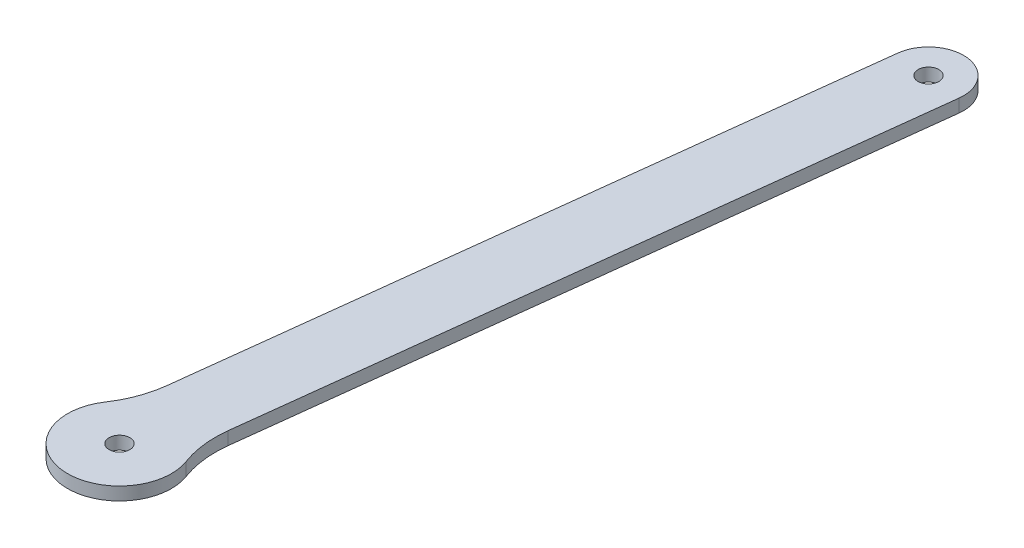
ISO-10303-21;
HEADER;
FILE_DESCRIPTION(('STEP AP214'),'2;1');
FILE_NAME('part.step','',(''),(''),'','','');
FILE_SCHEMA(('AUTOMOTIVE_DESIGN { 1 0 10303 214 1 1 1 1 }'));
ENDSEC;
DATA;
#1=APPLICATION_CONTEXT('core data for automotive mechanical design processes');
#2=APPLICATION_PROTOCOL_DEFINITION('international standard','automotive_design',2000,#1);
#3=PRODUCT_CONTEXT('',#1,'mechanical');
#4=PRODUCT('Part','Part','',(#3));
#5=PRODUCT_RELATED_PRODUCT_CATEGORY('part','',(#4));
#6=PRODUCT_DEFINITION_FORMATION('','',#4);
#7=PRODUCT_DEFINITION_CONTEXT('part definition',#1,'design');
#8=PRODUCT_DEFINITION('design','',#6,#7);
#9=PRODUCT_DEFINITION_SHAPE('','',#8);
#10=(LENGTH_UNIT() NAMED_UNIT(*) SI_UNIT(.MILLI.,.METRE.));
#11=(NAMED_UNIT(*) PLANE_ANGLE_UNIT() SI_UNIT($,.RADIAN.));
#12=(NAMED_UNIT(*) SI_UNIT($,.STERADIAN.) SOLID_ANGLE_UNIT());
#13=UNCERTAINTY_MEASURE_WITH_UNIT(LENGTH_MEASURE(1.E-05),#10,'distance_accuracy_value','');
#14=(GEOMETRIC_REPRESENTATION_CONTEXT(3) GLOBAL_UNCERTAINTY_ASSIGNED_CONTEXT((#13)) GLOBAL_UNIT_ASSIGNED_CONTEXT((#10,
#11,#12)) REPRESENTATION_CONTEXT('',''));
#15=CARTESIAN_POINT('',(0.,0.,0.));
#16=DIRECTION('',(0.,0.,1.));
#17=DIRECTION('',(1.,0.,0.));
#18=AXIS2_PLACEMENT_3D('',#15,#16,#17);
#19=CARTESIAN_POINT('',(25.654,-50.8574683301547,-3.78135023293424E-11));
#20=DIRECTION('',(0.,-1.,0.));
#21=DIRECTION('',(1.,0.,0.));
#22=AXIS2_PLACEMENT_3D('',#19,#20,#21);
#23=PLANE('',#22);
#24=CARTESIAN_POINT('',(17.272,-50.8574683301547,70.7182535302327));
#25=DIRECTION('',(0.,-1.,0.));
#26=DIRECTION('',(1.,0.,0.));
#27=AXIS2_PLACEMENT_3D('',#24,#25,#26);
#28=CIRCLE('',#27,1.01599999999988);
#29=CARTESIAN_POINT('',(18.2879999999999,-50.8574683301547,70.7182535302327));
#30=VERTEX_POINT('',#29);
#31=EDGE_CURVE('E151',#30,#30,#28,.T.);
#32=ORIENTED_EDGE('',*,*,#31,.F.);
#33=EDGE_LOOP('',(#32));
#34=FACE_BOUND('',#33,.T.);
#35=CARTESIAN_POINT('',(25.654,-50.8574683301547,-3.78135023293424E-11));
#36=DIRECTION('',(0.,-1.,0.));
#37=DIRECTION('',(1.,0.,0.));
#38=AXIS2_PLACEMENT_3D('',#35,#36,#37);
#39=CIRCLE('',#38,3.429);
#40=CARTESIAN_POINT('',(22.2488354325944,-50.8574683301547,-0.403602860390931));
#41=VERTEX_POINT('',#40);
#42=CARTESIAN_POINT('',(29.0591645674056,-50.8574683301547,0.403602860315304));
#43=VERTEX_POINT('',#42);
#44=EDGE_CURVE('E98',#41,#43,#39,.T.);
#45=ORIENTED_EDGE('',*,*,#44,.T.);
#46=DIRECTION('',(-0.117702788087815,0.,0.993048867718178));
#47=VECTOR('',#46,1.);
#48=CARTESIAN_POINT('',(29.0591645674056,-50.8574683301547,0.403602860315304));
#49=LINE('',#48,#47);
#50=CARTESIAN_POINT('',(21.4846808329558,-50.8574683301547,64.3089072141369));
#51=VERTEX_POINT('',#50);
#52=EDGE_CURVE('E89',#43,#51,#49,.T.);
#53=ORIENTED_EDGE('',*,*,#52,.T.);
#54=CARTESIAN_POINT('',(31.4151695101375,-50.8574683301547,65.4859350950151));
#55=DIRECTION('',(0.,-1.,0.));
#56=DIRECTION('',(1.,0.,0.));
#57=AXIS2_PLACEMENT_3D('',#54,#55,#56);
#58=CIRCLE('',#57,10.);
#59=CARTESIAN_POINT('',(22.0364098880305,-50.8574683301547,68.9556422801726));
#60=VERTEX_POINT('',#59);
#61=EDGE_CURVE('E11',#51,#60,#58,.F.);
#62=ORIENTED_EDGE('',*,*,#61,.T.);
#63=CARTESIAN_POINT('',(17.272,-50.8574683301547,70.7182535302327));
#64=DIRECTION('',(0.,-1.,0.));
#65=DIRECTION('',(1.,0.,0.));
#66=AXIS2_PLACEMENT_3D('',#63,#64,#65);
#67=CIRCLE('',#66,5.0800000000001);
#68=CARTESIAN_POINT('',(13.0516461635603,-50.8574683301547,67.8907080407224));
#69=VERTEX_POINT('',#68);
#70=EDGE_CURVE('E97',#60,#69,#67,.T.);
#71=ORIENTED_EDGE('',*,*,#70,.T.);
#72=CARTESIAN_POINT('',(4.74386302096273,-50.8574683301547,62.3246736125526));
#73=DIRECTION('',(0.,-1.,0.));
#74=DIRECTION('',(1.,0.,0.));
#75=AXIS2_PLACEMENT_3D('',#72,#73,#74);
#76=CIRCLE('',#75,10.);
#77=CARTESIAN_POINT('',(14.6743516981445,-50.8574683301547,63.5017014934308));
#78=VERTEX_POINT('',#77);
#79=EDGE_CURVE('E128',#69,#78,#76,.F.);
#80=ORIENTED_EDGE('',*,*,#79,.T.);
#81=DIRECTION('',(0.117702788087815,0.,-0.993048867718178));
#82=VECTOR('',#81,1.);
#83=CARTESIAN_POINT('',(22.2488354325944,-50.8574683301547,-0.403602860390931));
#84=LINE('',#83,#82);
#85=EDGE_CURVE('E103',#78,#41,#84,.T.);
#86=ORIENTED_EDGE('',*,*,#85,.T.);
#87=EDGE_LOOP('',(#45,#53,#62,#71,#80,#86));
#88=FACE_BOUND('',#87,.T.);
#89=CARTESIAN_POINT('',(25.654,-50.8574683301547,-3.78135023293424E-11));
#90=DIRECTION('',(0.,-1.,0.));
#91=DIRECTION('',(1.,0.,0.));
#92=AXIS2_PLACEMENT_3D('',#89,#90,#91);
#93=CIRCLE('',#92,1.016);
#94=CARTESIAN_POINT('',(26.67,-50.8574683301547,-3.78135023293424E-11));
#95=VERTEX_POINT('',#94);
#96=EDGE_CURVE('E157',#95,#95,#93,.T.);
#97=ORIENTED_EDGE('',*,*,#96,.F.);
#98=EDGE_LOOP('',(#97));
#99=FACE_BOUND('',#98,.T.);
#100=ADVANCED_FACE('F40',(#34,#88,#99),#23,.T.);
#101=CARTESIAN_POINT('',(25.654,-49.5874683301547,-3.78135023293424E-11));
#102=DIRECTION('',(0.,-1.,0.));
#103=DIRECTION('',(1.,0.,0.));
#104=AXIS2_PLACEMENT_3D('',#101,#102,#103);
#105=PLANE('',#104);
#106=CARTESIAN_POINT('',(25.654,-49.5874683301547,-3.78135023293424E-11));
#107=DIRECTION('',(0.,-1.,0.));
#108=DIRECTION('',(1.,0.,0.));
#109=AXIS2_PLACEMENT_3D('',#106,#107,#108);
#110=CIRCLE('',#109,3.429);
#111=CARTESIAN_POINT('',(22.2488354325944,-49.5874683301547,-0.403602860390931));
#112=VERTEX_POINT('',#111);
#113=CARTESIAN_POINT('',(29.0591645674056,-49.5874683301547,0.403602860315304));
#114=VERTEX_POINT('',#113);
#115=EDGE_CURVE('E111',#112,#114,#110,.T.);
#116=ORIENTED_EDGE('',*,*,#115,.F.);
#117=DIRECTION('',(0.117702788087815,0.,-0.993048867718178));
#118=VECTOR('',#117,1.);
#119=CARTESIAN_POINT('',(22.2488354325944,-49.5874683301547,-0.403602860390931));
#120=LINE('',#119,#118);
#121=CARTESIAN_POINT('',(14.6743516981445,-49.5874683301547,63.5017014934308));
#122=VERTEX_POINT('',#121);
#123=EDGE_CURVE('E107',#122,#112,#120,.T.);
#124=ORIENTED_EDGE('',*,*,#123,.F.);
#125=CARTESIAN_POINT('',(4.74386302096273,-49.5874683301547,62.3246736125526));
#126=DIRECTION('',(0.,-1.,0.));
#127=DIRECTION('',(1.,0.,0.));
#128=AXIS2_PLACEMENT_3D('',#125,#126,#127);
#129=CIRCLE('',#128,10.);
#130=CARTESIAN_POINT('',(13.0516461635603,-49.5874683301547,67.8907080407224));
#131=VERTEX_POINT('',#130);
#132=EDGE_CURVE('E126',#122,#131,#129,.T.);
#133=ORIENTED_EDGE('',*,*,#132,.T.);
#134=CARTESIAN_POINT('',(17.272,-49.5874683301547,70.7182535302327));
#135=DIRECTION('',(0.,-1.,0.));
#136=DIRECTION('',(1.,0.,0.));
#137=AXIS2_PLACEMENT_3D('',#134,#135,#136);
#138=CIRCLE('',#137,5.0800000000001);
#139=CARTESIAN_POINT('',(22.0364098880305,-49.5874683301547,68.9556422801726));
#140=VERTEX_POINT('',#139);
#141=EDGE_CURVE('E143',#140,#131,#138,.T.);
#142=ORIENTED_EDGE('',*,*,#141,.F.);
#143=CARTESIAN_POINT('',(31.4151695101375,-49.5874683301547,65.4859350950151));
#144=DIRECTION('',(0.,-1.,0.));
#145=DIRECTION('',(1.,0.,0.));
#146=AXIS2_PLACEMENT_3D('',#143,#144,#145);
#147=CIRCLE('',#146,10.);
#148=CARTESIAN_POINT('',(21.4846808329558,-49.5874683301547,64.3089072141369));
#149=VERTEX_POINT('',#148);
#150=EDGE_CURVE('E48',#140,#149,#147,.T.);
#151=ORIENTED_EDGE('',*,*,#150,.T.);
#152=DIRECTION('',(-0.117702788087815,0.,0.993048867718178));
#153=VECTOR('',#152,1.);
#154=CARTESIAN_POINT('',(29.0591645674056,-49.5874683301547,0.403602860315304));
#155=LINE('',#154,#153);
#156=EDGE_CURVE('E147',#114,#149,#155,.T.);
#157=ORIENTED_EDGE('',*,*,#156,.F.);
#158=EDGE_LOOP('',(#116,#124,#133,#142,#151,#157));
#159=FACE_BOUND('',#158,.T.);
#160=CARTESIAN_POINT('',(17.272,-49.5874683301547,70.7182535302327));
#161=DIRECTION('',(0.,-1.,0.));
#162=DIRECTION('',(1.,0.,0.));
#163=AXIS2_PLACEMENT_3D('',#160,#161,#162);
#164=CIRCLE('',#163,1.01599999999988);
#165=CARTESIAN_POINT('',(18.2879999999999,-49.5874683301547,70.7182535302327));
#166=VERTEX_POINT('',#165);
#167=EDGE_CURVE('E154',#166,#166,#164,.T.);
#168=ORIENTED_EDGE('',*,*,#167,.T.);
#169=EDGE_LOOP('',(#168));
#170=FACE_BOUND('',#169,.T.);
#171=CARTESIAN_POINT('',(25.654,-49.5874683301547,-3.78135023293424E-11));
#172=DIRECTION('',(0.,-1.,0.));
#173=DIRECTION('',(1.,0.,0.));
#174=AXIS2_PLACEMENT_3D('',#171,#172,#173);
#175=CIRCLE('',#174,1.016);
#176=CARTESIAN_POINT('',(26.67,-49.5874683301547,-3.78135023293424E-11));
#177=VERTEX_POINT('',#176);
#178=EDGE_CURVE('E160',#177,#177,#175,.T.);
#179=ORIENTED_EDGE('',*,*,#178,.T.);
#180=EDGE_LOOP('',(#179));
#181=FACE_BOUND('',#180,.T.);
#182=ADVANCED_FACE('F141',(#159,#170,#181),#105,.F.);
#183=CARTESIAN_POINT('',(25.654,-50.8574683301547,-3.78135023293424E-11));
#184=DIRECTION('',(0.,1.,0.));
#185=DIRECTION('',(-1.,0.,0.));
#186=AXIS2_PLACEMENT_3D('',#183,#184,#185);
#187=CYLINDRICAL_SURFACE('',#186,3.429);
#188=ORIENTED_EDGE('',*,*,#115,.T.);
#189=DIRECTION('',(0.,1.,0.));
#190=VECTOR('',#189,1.);
#191=CARTESIAN_POINT('',(29.0591645674056,-50.8574683301547,0.403602860315304));
#192=LINE('',#191,#190);
#193=EDGE_CURVE('E93',#43,#114,#192,.T.);
#194=ORIENTED_EDGE('',*,*,#193,.F.);
#195=ORIENTED_EDGE('',*,*,#44,.F.);
#196=DIRECTION('',(0.,1.,0.));
#197=VECTOR('',#196,1.);
#198=CARTESIAN_POINT('',(22.2488354325944,-50.8574683301547,-0.403602860390931));
#199=LINE('',#198,#197);
#200=EDGE_CURVE('E113',#41,#112,#199,.T.);
#201=ORIENTED_EDGE('',*,*,#200,.T.);
#202=EDGE_LOOP('',(#188,#194,#195,#201));
#203=FACE_BOUND('',#202,.T.);
#204=ADVANCED_FACE('F109',(#203),#187,.T.);
#205=CARTESIAN_POINT('',(29.0591645674056,-50.8574683301547,0.403602860315304));
#206=DIRECTION('',(-0.993048867718178,0.,-0.117702788087815));
#207=DIRECTION('',(-0.117702788087815,0.,0.993048867718178));
#208=AXIS2_PLACEMENT_3D('',#205,#206,#207);
#209=PLANE('',#208);
#210=ORIENTED_EDGE('',*,*,#156,.T.);
#211=DIRECTION('',(0.,-1.,0.));
#212=VECTOR('',#211,1.);
#213=CARTESIAN_POINT('',(21.4846808329558,-50.8574683301547,64.3089072141369));
#214=LINE('',#213,#212);
#215=EDGE_CURVE('E55',#149,#51,#214,.T.);
#216=ORIENTED_EDGE('',*,*,#215,.T.);
#217=ORIENTED_EDGE('',*,*,#52,.F.);
#218=ORIENTED_EDGE('',*,*,#193,.T.);
#219=EDGE_LOOP('',(#210,#216,#217,#218));
#220=FACE_BOUND('',#219,.T.);
#221=ADVANCED_FACE('F91',(#220),#209,.F.);
#222=CARTESIAN_POINT('',(17.272,-50.8574683301547,70.7182535302327));
#223=DIRECTION('',(0.,1.,0.));
#224=DIRECTION('',(-1.,0.,0.));
#225=AXIS2_PLACEMENT_3D('',#222,#223,#224);
#226=CYLINDRICAL_SURFACE('',#225,5.0800000000001);
#227=ORIENTED_EDGE('',*,*,#141,.T.);
#228=DIRECTION('',(0.,1.,0.));
#229=VECTOR('',#228,1.);
#230=CARTESIAN_POINT('',(13.0516461635603,-50.8574683301547,67.8907080407224));
#231=LINE('',#230,#229);
#232=EDGE_CURVE('E123',#131,#69,#231,.F.);
#233=ORIENTED_EDGE('',*,*,#232,.T.);
#234=ORIENTED_EDGE('',*,*,#70,.F.);
#235=DIRECTION('',(0.,1.,0.));
#236=VECTOR('',#235,1.);
#237=CARTESIAN_POINT('',(22.0364098880305,-50.8574683301547,68.9556422801726));
#238=LINE('',#237,#236);
#239=EDGE_CURVE('E116',#60,#140,#238,.T.);
#240=ORIENTED_EDGE('',*,*,#239,.T.);
#241=EDGE_LOOP('',(#227,#233,#234,#240));
#242=FACE_BOUND('',#241,.T.);
#243=ADVANCED_FACE('F145',(#242),#226,.T.);
#244=CARTESIAN_POINT('',(22.2488354325944,-50.8574683301547,-0.403602860390931));
#245=DIRECTION('',(0.993048867718178,0.,0.117702788087815));
#246=DIRECTION('',(0.117702788087815,0.,-0.993048867718178));
#247=AXIS2_PLACEMENT_3D('',#244,#245,#246);
#248=PLANE('',#247);
#249=ORIENTED_EDGE('',*,*,#85,.F.);
#250=DIRECTION('',(0.,-1.,0.));
#251=VECTOR('',#250,1.);
#252=CARTESIAN_POINT('',(14.6743516981445,-49.5874683301547,63.5017014934308));
#253=LINE('',#252,#251);
#254=EDGE_CURVE('E112',#78,#122,#253,.F.);
#255=ORIENTED_EDGE('',*,*,#254,.T.);
#256=ORIENTED_EDGE('',*,*,#123,.T.);
#257=ORIENTED_EDGE('',*,*,#200,.F.);
#258=EDGE_LOOP('',(#249,#255,#256,#257));
#259=FACE_BOUND('',#258,.T.);
#260=ADVANCED_FACE('F136',(#259),#248,.F.);
#261=CARTESIAN_POINT('',(17.272,-50.8574683301547,70.7182535302327));
#262=DIRECTION('',(0.,1.,0.));
#263=DIRECTION('',(-1.,0.,0.));
#264=AXIS2_PLACEMENT_3D('',#261,#262,#263);
#265=CYLINDRICAL_SURFACE('',#264,1.01599999999988);
#266=ORIENTED_EDGE('',*,*,#31,.T.);
#267=EDGE_LOOP('',(#266));
#268=FACE_BOUND('',#267,.T.);
#269=ORIENTED_EDGE('',*,*,#167,.F.);
#270=EDGE_LOOP('',(#269));
#271=FACE_BOUND('',#270,.T.);
#272=ADVANCED_FACE('F177',(#268,#271),#265,.F.);
#273=CARTESIAN_POINT('',(25.654,-50.8574683301547,-3.78135023293424E-11));
#274=DIRECTION('',(0.,1.,0.));
#275=DIRECTION('',(-1.,0.,0.));
#276=AXIS2_PLACEMENT_3D('',#273,#274,#275);
#277=CYLINDRICAL_SURFACE('',#276,1.016);
#278=ORIENTED_EDGE('',*,*,#96,.T.);
#279=EDGE_LOOP('',(#278));
#280=FACE_BOUND('',#279,.T.);
#281=ORIENTED_EDGE('',*,*,#178,.F.);
#282=EDGE_LOOP('',(#281));
#283=FACE_BOUND('',#282,.T.);
#284=ADVANCED_FACE('F166',(#280,#283),#277,.F.);
#285=CARTESIAN_POINT('',(4.74386302096273,-50.8574683301547,62.3246736125526));
#286=DIRECTION('',(0.,1.,0.));
#287=DIRECTION('',(-1.,0.,0.));
#288=AXIS2_PLACEMENT_3D('',#285,#286,#287);
#289=CYLINDRICAL_SURFACE('',#288,10.);
#290=ORIENTED_EDGE('',*,*,#79,.F.);
#291=ORIENTED_EDGE('',*,*,#232,.F.);
#292=ORIENTED_EDGE('',*,*,#132,.F.);
#293=ORIENTED_EDGE('',*,*,#254,.F.);
#294=EDGE_LOOP('',(#290,#291,#292,#293));
#295=FACE_BOUND('',#294,.T.);
#296=ADVANCED_FACE('F139',(#295),#289,.F.);
#297=CARTESIAN_POINT('',(31.4151695101375,-50.8574683301547,65.4859350950151));
#298=DIRECTION('',(0.,1.,0.));
#299=DIRECTION('',(-1.,0.,0.));
#300=AXIS2_PLACEMENT_3D('',#297,#298,#299);
#301=CYLINDRICAL_SURFACE('',#300,10.);
#302=ORIENTED_EDGE('',*,*,#61,.F.);
#303=ORIENTED_EDGE('',*,*,#215,.F.);
#304=ORIENTED_EDGE('',*,*,#150,.F.);
#305=ORIENTED_EDGE('',*,*,#239,.F.);
#306=EDGE_LOOP('',(#302,#303,#304,#305));
#307=FACE_BOUND('',#306,.T.);
#308=ADVANCED_FACE('F42',(#307),#301,.F.);
#309=CLOSED_SHELL('',(#100,#182,#204,#221,#243,#260,#272,#284,#296,#308));
#310=MANIFOLD_SOLID_BREP('B2',#309);
#311=ADVANCED_BREP_SHAPE_REPRESENTATION('',(#18,#310),#14);
#312=SHAPE_DEFINITION_REPRESENTATION(#9,#311);
ENDSEC;
END-ISO-10303-21;
